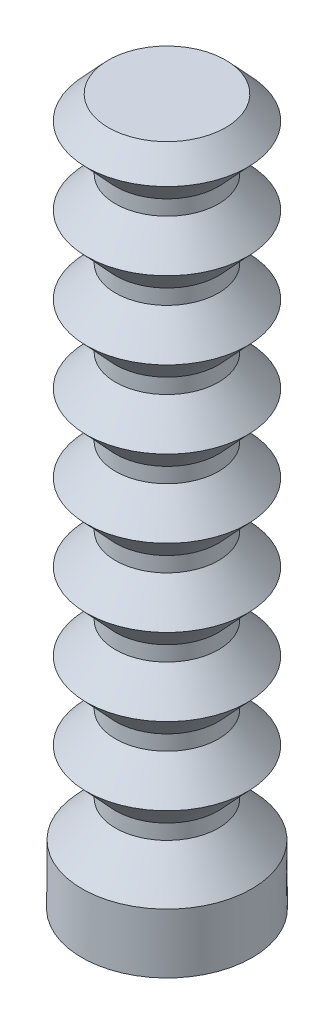
ISO-10303-21;
HEADER;
FILE_DESCRIPTION(('STEP AP214'),'2;1');
FILE_NAME('part.step','',(''),(''),'','','');
FILE_SCHEMA(('AUTOMOTIVE_DESIGN { 1 0 10303 214 1 1 1 1 }'));
ENDSEC;
DATA;
#1=APPLICATION_CONTEXT('core data for automotive mechanical design processes');
#2=APPLICATION_PROTOCOL_DEFINITION('international standard','automotive_design',2000,#1);
#3=PRODUCT_CONTEXT('',#1,'mechanical');
#4=PRODUCT('Part','Part','',(#3));
#5=PRODUCT_RELATED_PRODUCT_CATEGORY('part','',(#4));
#6=PRODUCT_DEFINITION_FORMATION('','',#4);
#7=PRODUCT_DEFINITION_CONTEXT('part definition',#1,'design');
#8=PRODUCT_DEFINITION('design','',#6,#7);
#9=PRODUCT_DEFINITION_SHAPE('','',#8);
#10=(LENGTH_UNIT() NAMED_UNIT(*) SI_UNIT(.MILLI.,.METRE.));
#11=(NAMED_UNIT(*) PLANE_ANGLE_UNIT() SI_UNIT($,.RADIAN.));
#12=(NAMED_UNIT(*) SI_UNIT($,.STERADIAN.) SOLID_ANGLE_UNIT());
#13=UNCERTAINTY_MEASURE_WITH_UNIT(LENGTH_MEASURE(1.E-05),#10,'distance_accuracy_value','');
#14=(GEOMETRIC_REPRESENTATION_CONTEXT(3) GLOBAL_UNCERTAINTY_ASSIGNED_CONTEXT((#13)) GLOBAL_UNIT_ASSIGNED_CONTEXT((#10,
#11,#12)) REPRESENTATION_CONTEXT('',''));
#15=CARTESIAN_POINT('',(0.,0.,0.));
#16=DIRECTION('',(0.,0.,1.));
#17=DIRECTION('',(1.,0.,0.));
#18=AXIS2_PLACEMENT_3D('',#15,#16,#17);
#19=CARTESIAN_POINT('',(-0.490246862964917,-0.95443319236906,0.));
#20=DIRECTION('',(0.,1.,0.));
#21=DIRECTION('',(-1.,0.,0.));
#22=AXIS2_PLACEMENT_3D('',#19,#20,#21);
#23=PLANE('',#22);
#24=CARTESIAN_POINT('',(-5.43163068128709,-0.954433192369061,0.));
#25=DIRECTION('',(0.,1.,0.));
#26=DIRECTION('',(-1.,0.,0.));
#27=AXIS2_PLACEMENT_3D('',#24,#25,#26);
#28=CIRCLE('',#27,4.13680574095251);
#29=CARTESIAN_POINT('',(-9.5684364222396,-0.954433192369061,0.));
#30=VERTEX_POINT('',#29);
#31=EDGE_CURVE('E38',#30,#30,#28,.F.);
#32=ORIENTED_EDGE('',*,*,#31,.T.);
#33=EDGE_LOOP('',(#32));
#34=FACE_BOUND('',#33,.T.);
#35=ADVANCED_FACE('F35',(#34),#23,.F.);
#36=CARTESIAN_POINT('',(-5.43163068128709,2.24093670680307,0.));
#37=DIRECTION('',(0.,-1.,0.));
#38=DIRECTION('',(1.,0.,0.));
#39=AXIS2_PLACEMENT_3D('',#36,#37,#38);
#40=CONICAL_SURFACE('',#39,4.11857195113181,0.00570625388925565);
#41=ORIENTED_EDGE('',*,*,#31,.F.);
#42=EDGE_LOOP('',(#41));
#43=FACE_BOUND('',#42,.T.);
#44=CARTESIAN_POINT('',(-5.43163068128709,1.92940061099429,0.));
#45=DIRECTION('',(0.,-1.,0.));
#46=DIRECTION('',(1.,0.,0.));
#47=AXIS2_PLACEMENT_3D('',#44,#45,#46);
#48=CIRCLE('',#47,4.12034967448522);
#49=CARTESIAN_POINT('',(-1.31128100680187,1.92940061099429,0.));
#50=VERTEX_POINT('',#49);
#51=EDGE_CURVE('E117',#50,#50,#48,.T.);
#52=ORIENTED_EDGE('',*,*,#51,.T.);
#53=EDGE_LOOP('',(#52));
#54=FACE_BOUND('',#53,.T.);
#55=ADVANCED_FACE('F125',(#43,#54),#40,.T.);
#56=CARTESIAN_POINT('',(-5.43163068128709,3.44402255402613,0.));
#57=DIRECTION('',(0.,-1.,0.));
#58=DIRECTION('',(1.,0.,0.));
#59=AXIS2_PLACEMENT_3D('',#56,#57,#58);
#60=CONICAL_SURFACE('',#59,2.7137894410461,0.74842256535505);
#61=ORIENTED_EDGE('',*,*,#51,.F.);
#62=EDGE_LOOP('',(#61));
#63=FACE_BOUND('',#62,.T.);
#64=CARTESIAN_POINT('',(-5.43163068128709,3.6742367822535,0.));
#65=DIRECTION('',(0.,-1.,0.));
#66=DIRECTION('',(1.,0.,0.));
#67=AXIS2_PLACEMENT_3D('',#64,#65,#66);
#68=CIRCLE('',#67,2.50000000000029);
#69=CARTESIAN_POINT('',(-2.9316306812868,3.6742367822535,0.));
#70=VERTEX_POINT('',#69);
#71=EDGE_CURVE('E115',#70,#70,#68,.T.);
#72=ORIENTED_EDGE('',*,*,#71,.T.);
#73=EDGE_LOOP('',(#72));
#74=FACE_BOUND('',#73,.T.);
#75=ADVANCED_FACE('F127',(#63,#74),#60,.T.);
#76=CARTESIAN_POINT('',(-5.43163068128709,34.1029540037317,0.));
#77=DIRECTION('',(0.,-1.,0.));
#78=DIRECTION('',(1.,0.,0.));
#79=AXIS2_PLACEMENT_3D('',#76,#77,#78);
#80=CYLINDRICAL_SURFACE('',#79,2.50000000000029);
#81=ORIENTED_EDGE('',*,*,#71,.F.);
#82=EDGE_LOOP('',(#81));
#83=FACE_BOUND('',#82,.T.);
#84=CARTESIAN_POINT('',(-5.43163068128709,4.40328862763758,0.));
#85=DIRECTION('',(0.,1.,0.));
#86=DIRECTION('',(-1.,0.,0.));
#87=AXIS2_PLACEMENT_3D('',#84,#85,#86);
#88=CIRCLE('',#87,2.50000000000029);
#89=CARTESIAN_POINT('',(-7.93163068128738,4.40328862763758,0.));
#90=VERTEX_POINT('',#89);
#91=EDGE_CURVE('E112',#90,#90,#88,.F.);
#92=ORIENTED_EDGE('',*,*,#91,.T.);
#93=EDGE_LOOP('',(#92));
#94=FACE_BOUND('',#93,.T.);
#95=ADVANCED_FACE('F132',(#83,#94),#80,.T.);
#96=CARTESIAN_POINT('',(-5.43163068128709,6.45869245496514,0.));
#97=DIRECTION('',(0.,1.,0.));
#98=DIRECTION('',(-1.,0.,0.));
#99=AXIS2_PLACEMENT_3D('',#96,#97,#98);
#100=CONICAL_SURFACE('',#99,4.41462274326432,0.749952023138733);
#101=ORIENTED_EDGE('',*,*,#91,.F.);
#102=EDGE_LOOP('',(#101));
#103=FACE_BOUND('',#102,.T.);
#104=CARTESIAN_POINT('',(-5.43163068128709,5.91340953088234,0.));
#105=DIRECTION('',(0.,-1.,0.));
#106=DIRECTION('',(1.,0.,0.));
#107=AXIS2_PLACEMENT_3D('',#104,#105,#106);
#108=CIRCLE('',#107,3.90668796466664);
#109=CARTESIAN_POINT('',(-1.52494271662045,5.91340953088234,0.));
#110=VERTEX_POINT('',#109);
#111=EDGE_CURVE('E109',#110,#110,#108,.T.);
#112=ORIENTED_EDGE('',*,*,#111,.T.);
#113=EDGE_LOOP('',(#112));
#114=FACE_BOUND('',#113,.T.);
#115=ADVANCED_FACE('F229',(#103,#114),#100,.T.);
#116=CARTESIAN_POINT('',(-5.43163068128709,7.19312660679953,0.));
#117=DIRECTION('',(0.,-1.,0.));
#118=DIRECTION('',(1.,0.,0.));
#119=AXIS2_PLACEMENT_3D('',#116,#117,#118);
#120=CONICAL_SURFACE('',#119,2.71462274326432,0.749952023138734);
#121=ORIENTED_EDGE('',*,*,#111,.F.);
#122=EDGE_LOOP('',(#121));
#123=FACE_BOUND('',#122,.T.);
#124=CARTESIAN_POINT('',(-5.43163068128709,7.42353043412714,0.));
#125=DIRECTION('',(0.,-1.,0.));
#126=DIRECTION('',(1.,0.,0.));
#127=AXIS2_PLACEMENT_3D('',#124,#125,#126);
#128=CIRCLE('',#127,2.50000000000025);
#129=CARTESIAN_POINT('',(-2.93163068128684,7.42353043412714,0.));
#130=VERTEX_POINT('',#129);
#131=EDGE_CURVE('E106',#130,#130,#128,.T.);
#132=ORIENTED_EDGE('',*,*,#131,.T.);
#133=EDGE_LOOP('',(#132));
#134=FACE_BOUND('',#133,.T.);
#135=ADVANCED_FACE('F225',(#123,#134),#120,.T.);
#136=CARTESIAN_POINT('',(-5.43163068128709,34.1029540037317,0.));
#137=DIRECTION('',(0.,-1.,0.));
#138=DIRECTION('',(1.,0.,0.));
#139=AXIS2_PLACEMENT_3D('',#136,#137,#138);
#140=CYLINDRICAL_SURFACE('',#139,2.50000000000025);
#141=ORIENTED_EDGE('',*,*,#131,.F.);
#142=EDGE_LOOP('',(#141));
#143=FACE_BOUND('',#142,.T.);
#144=CARTESIAN_POINT('',(-5.43163068128709,8.15328862763762,0.));
#145=DIRECTION('',(0.,1.,0.));
#146=DIRECTION('',(-1.,0.,0.));
#147=AXIS2_PLACEMENT_3D('',#144,#145,#146);
#148=CIRCLE('',#147,2.50000000000025);
#149=CARTESIAN_POINT('',(-7.93163068128734,8.15328862763762,0.));
#150=VERTEX_POINT('',#149);
#151=EDGE_CURVE('E103',#150,#150,#148,.F.);
#152=ORIENTED_EDGE('',*,*,#151,.T.);
#153=EDGE_LOOP('',(#152));
#154=FACE_BOUND('',#153,.T.);
#155=ADVANCED_FACE('F221',(#143,#154),#140,.T.);
#156=CARTESIAN_POINT('',(-5.43163068128709,10.2086924549652,0.));
#157=DIRECTION('',(0.,1.,0.));
#158=DIRECTION('',(-1.,0.,0.));
#159=AXIS2_PLACEMENT_3D('',#156,#157,#158);
#160=CONICAL_SURFACE('',#159,4.41462274326428,0.749952023138734);
#161=ORIENTED_EDGE('',*,*,#151,.F.);
#162=EDGE_LOOP('',(#161));
#163=FACE_BOUND('',#162,.T.);
#164=CARTESIAN_POINT('',(-5.43163068128709,9.66340953088238,0.));
#165=DIRECTION('',(0.,-1.,0.));
#166=DIRECTION('',(1.,0.,0.));
#167=AXIS2_PLACEMENT_3D('',#164,#165,#166);
#168=CIRCLE('',#167,3.9066879646666);
#169=CARTESIAN_POINT('',(-1.52494271662049,9.66340953088238,0.));
#170=VERTEX_POINT('',#169);
#171=EDGE_CURVE('E100',#170,#170,#168,.T.);
#172=ORIENTED_EDGE('',*,*,#171,.T.);
#173=EDGE_LOOP('',(#172));
#174=FACE_BOUND('',#173,.T.);
#175=ADVANCED_FACE('F217',(#163,#174),#160,.T.);
#176=CARTESIAN_POINT('',(-5.43163068128709,10.9431266067996,0.));
#177=DIRECTION('',(0.,-1.,0.));
#178=DIRECTION('',(1.,0.,0.));
#179=AXIS2_PLACEMENT_3D('',#176,#177,#178);
#180=CONICAL_SURFACE('',#179,2.71462274326428,0.749952023138734);
#181=ORIENTED_EDGE('',*,*,#171,.F.);
#182=EDGE_LOOP('',(#181));
#183=FACE_BOUND('',#182,.T.);
#184=CARTESIAN_POINT('',(-5.43163068128709,11.1735304341272,0.));
#185=DIRECTION('',(0.,-1.,0.));
#186=DIRECTION('',(1.,0.,0.));
#187=AXIS2_PLACEMENT_3D('',#184,#185,#186);
#188=CIRCLE('',#187,2.50000000000021);
#189=CARTESIAN_POINT('',(-2.93163068128688,11.1735304341272,0.));
#190=VERTEX_POINT('',#189);
#191=EDGE_CURVE('E97',#190,#190,#188,.T.);
#192=ORIENTED_EDGE('',*,*,#191,.T.);
#193=EDGE_LOOP('',(#192));
#194=FACE_BOUND('',#193,.T.);
#195=ADVANCED_FACE('F213',(#183,#194),#180,.T.);
#196=CARTESIAN_POINT('',(-5.43163068128709,34.1029540037317,0.));
#197=DIRECTION('',(0.,-1.,0.));
#198=DIRECTION('',(1.,0.,0.));
#199=AXIS2_PLACEMENT_3D('',#196,#197,#198);
#200=CYLINDRICAL_SURFACE('',#199,2.50000000000021);
#201=ORIENTED_EDGE('',*,*,#191,.F.);
#202=EDGE_LOOP('',(#201));
#203=FACE_BOUND('',#202,.T.);
#204=CARTESIAN_POINT('',(-5.43163068128709,11.9032886276377,0.));
#205=DIRECTION('',(0.,1.,0.));
#206=DIRECTION('',(-1.,0.,0.));
#207=AXIS2_PLACEMENT_3D('',#204,#205,#206);
#208=CIRCLE('',#207,2.50000000000021);
#209=CARTESIAN_POINT('',(-7.93163068128731,11.9032886276377,0.));
#210=VERTEX_POINT('',#209);
#211=EDGE_CURVE('E94',#210,#210,#208,.F.);
#212=ORIENTED_EDGE('',*,*,#211,.T.);
#213=EDGE_LOOP('',(#212));
#214=FACE_BOUND('',#213,.T.);
#215=ADVANCED_FACE('F209',(#203,#214),#200,.T.);
#216=CARTESIAN_POINT('',(-5.43163068128709,13.9586924549652,0.));
#217=DIRECTION('',(0.,1.,0.));
#218=DIRECTION('',(-1.,0.,0.));
#219=AXIS2_PLACEMENT_3D('',#216,#217,#218);
#220=CONICAL_SURFACE('',#219,4.41462274326424,0.749952023138734);
#221=ORIENTED_EDGE('',*,*,#211,.F.);
#222=EDGE_LOOP('',(#221));
#223=FACE_BOUND('',#222,.T.);
#224=CARTESIAN_POINT('',(-5.43163068128709,13.4134095308824,0.));
#225=DIRECTION('',(0.,-1.,0.));
#226=DIRECTION('',(1.,0.,0.));
#227=AXIS2_PLACEMENT_3D('',#224,#225,#226);
#228=CIRCLE('',#227,3.90668796466656);
#229=CARTESIAN_POINT('',(-1.52494271662053,13.4134095308824,0.));
#230=VERTEX_POINT('',#229);
#231=EDGE_CURVE('E91',#230,#230,#228,.T.);
#232=ORIENTED_EDGE('',*,*,#231,.T.);
#233=EDGE_LOOP('',(#232));
#234=FACE_BOUND('',#233,.T.);
#235=ADVANCED_FACE('F205',(#223,#234),#220,.T.);
#236=CARTESIAN_POINT('',(-5.43163068128709,14.6931266067996,0.));
#237=DIRECTION('',(0.,-1.,0.));
#238=DIRECTION('',(1.,0.,0.));
#239=AXIS2_PLACEMENT_3D('',#236,#237,#238);
#240=CONICAL_SURFACE('',#239,2.71462274326424,0.749952023138734);
#241=ORIENTED_EDGE('',*,*,#231,.F.);
#242=EDGE_LOOP('',(#241));
#243=FACE_BOUND('',#242,.T.);
#244=CARTESIAN_POINT('',(-5.43163068128709,14.9235304341272,0.));
#245=DIRECTION('',(0.,-1.,0.));
#246=DIRECTION('',(1.,0.,0.));
#247=AXIS2_PLACEMENT_3D('',#244,#245,#246);
#248=CIRCLE('',#247,2.50000000000018);
#249=CARTESIAN_POINT('',(-2.93163068128692,14.9235304341272,0.));
#250=VERTEX_POINT('',#249);
#251=EDGE_CURVE('E88',#250,#250,#248,.T.);
#252=ORIENTED_EDGE('',*,*,#251,.T.);
#253=EDGE_LOOP('',(#252));
#254=FACE_BOUND('',#253,.T.);
#255=ADVANCED_FACE('F201',(#243,#254),#240,.T.);
#256=CARTESIAN_POINT('',(-5.43163068128709,34.1029540037317,0.));
#257=DIRECTION('',(0.,-1.,0.));
#258=DIRECTION('',(1.,0.,0.));
#259=AXIS2_PLACEMENT_3D('',#256,#257,#258);
#260=CYLINDRICAL_SURFACE('',#259,2.50000000000018);
#261=ORIENTED_EDGE('',*,*,#251,.F.);
#262=EDGE_LOOP('',(#261));
#263=FACE_BOUND('',#262,.T.);
#264=CARTESIAN_POINT('',(-5.43163068128709,15.6532886276377,0.));
#265=DIRECTION('',(0.,1.,0.));
#266=DIRECTION('',(-1.,0.,0.));
#267=AXIS2_PLACEMENT_3D('',#264,#265,#266);
#268=CIRCLE('',#267,2.50000000000018);
#269=CARTESIAN_POINT('',(-7.93163068128727,15.6532886276377,0.));
#270=VERTEX_POINT('',#269);
#271=EDGE_CURVE('E85',#270,#270,#268,.F.);
#272=ORIENTED_EDGE('',*,*,#271,.T.);
#273=EDGE_LOOP('',(#272));
#274=FACE_BOUND('',#273,.T.);
#275=ADVANCED_FACE('F197',(#263,#274),#260,.T.);
#276=CARTESIAN_POINT('',(-5.43163068128709,17.7086924549653,0.));
#277=DIRECTION('',(0.,1.,0.));
#278=DIRECTION('',(-1.,0.,0.));
#279=AXIS2_PLACEMENT_3D('',#276,#277,#278);
#280=CONICAL_SURFACE('',#279,4.4146227432642,0.749952023138733);
#281=ORIENTED_EDGE('',*,*,#271,.F.);
#282=EDGE_LOOP('',(#281));
#283=FACE_BOUND('',#282,.T.);
#284=CARTESIAN_POINT('',(-5.43163068128709,17.1634095308825,0.));
#285=DIRECTION('',(0.,-1.,0.));
#286=DIRECTION('',(1.,0.,0.));
#287=AXIS2_PLACEMENT_3D('',#284,#285,#286);
#288=CIRCLE('',#287,3.90668796466652);
#289=CARTESIAN_POINT('',(-1.52494271662057,17.1634095308825,0.));
#290=VERTEX_POINT('',#289);
#291=EDGE_CURVE('E82',#290,#290,#288,.T.);
#292=ORIENTED_EDGE('',*,*,#291,.T.);
#293=EDGE_LOOP('',(#292));
#294=FACE_BOUND('',#293,.T.);
#295=ADVANCED_FACE('F193',(#283,#294),#280,.T.);
#296=CARTESIAN_POINT('',(-5.43163068128709,18.4431266067997,0.));
#297=DIRECTION('',(0.,-1.,0.));
#298=DIRECTION('',(1.,0.,0.));
#299=AXIS2_PLACEMENT_3D('',#296,#297,#298);
#300=CONICAL_SURFACE('',#299,2.7146227432642,0.749952023138734);
#301=ORIENTED_EDGE('',*,*,#291,.F.);
#302=EDGE_LOOP('',(#301));
#303=FACE_BOUND('',#302,.T.);
#304=CARTESIAN_POINT('',(-5.43163068128709,18.6735304341273,0.));
#305=DIRECTION('',(0.,-1.,0.));
#306=DIRECTION('',(1.,0.,0.));
#307=AXIS2_PLACEMENT_3D('',#304,#305,#306);
#308=CIRCLE('',#307,2.50000000000014);
#309=CARTESIAN_POINT('',(-2.93163068128696,18.6735304341273,0.));
#310=VERTEX_POINT('',#309);
#311=EDGE_CURVE('E79',#310,#310,#308,.T.);
#312=ORIENTED_EDGE('',*,*,#311,.T.);
#313=EDGE_LOOP('',(#312));
#314=FACE_BOUND('',#313,.T.);
#315=ADVANCED_FACE('F189',(#303,#314),#300,.T.);
#316=CARTESIAN_POINT('',(-5.43163068128709,34.1029540037317,0.));
#317=DIRECTION('',(0.,-1.,0.));
#318=DIRECTION('',(1.,0.,0.));
#319=AXIS2_PLACEMENT_3D('',#316,#317,#318);
#320=CYLINDRICAL_SURFACE('',#319,2.50000000000014);
#321=ORIENTED_EDGE('',*,*,#311,.F.);
#322=EDGE_LOOP('',(#321));
#323=FACE_BOUND('',#322,.T.);
#324=CARTESIAN_POINT('',(-5.43163068128709,19.4032886276377,0.));
#325=DIRECTION('',(0.,1.,0.));
#326=DIRECTION('',(-1.,0.,0.));
#327=AXIS2_PLACEMENT_3D('',#324,#325,#326);
#328=CIRCLE('',#327,2.50000000000014);
#329=CARTESIAN_POINT('',(-7.93163068128723,19.4032886276377,0.));
#330=VERTEX_POINT('',#329);
#331=EDGE_CURVE('E76',#330,#330,#328,.F.);
#332=ORIENTED_EDGE('',*,*,#331,.T.);
#333=EDGE_LOOP('',(#332));
#334=FACE_BOUND('',#333,.T.);
#335=ADVANCED_FACE('F185',(#323,#334),#320,.T.);
#336=CARTESIAN_POINT('',(-5.43163068128709,21.4586924549653,0.));
#337=DIRECTION('',(0.,1.,0.));
#338=DIRECTION('',(-1.,0.,0.));
#339=AXIS2_PLACEMENT_3D('',#336,#337,#338);
#340=CONICAL_SURFACE('',#339,4.41462274326417,0.749952023138733);
#341=ORIENTED_EDGE('',*,*,#331,.F.);
#342=EDGE_LOOP('',(#341));
#343=FACE_BOUND('',#342,.T.);
#344=CARTESIAN_POINT('',(-5.43163068128709,20.9134095308825,0.));
#345=DIRECTION('',(0.,-1.,0.));
#346=DIRECTION('',(1.,0.,0.));
#347=AXIS2_PLACEMENT_3D('',#344,#345,#346);
#348=CIRCLE('',#347,3.90668796466648);
#349=CARTESIAN_POINT('',(-1.52494271662061,20.9134095308825,0.));
#350=VERTEX_POINT('',#349);
#351=EDGE_CURVE('E73',#350,#350,#348,.T.);
#352=ORIENTED_EDGE('',*,*,#351,.T.);
#353=EDGE_LOOP('',(#352));
#354=FACE_BOUND('',#353,.T.);
#355=ADVANCED_FACE('F181',(#343,#354),#340,.T.);
#356=CARTESIAN_POINT('',(-5.43163068128709,22.1931266067997,0.));
#357=DIRECTION('',(0.,-1.,0.));
#358=DIRECTION('',(1.,0.,0.));
#359=AXIS2_PLACEMENT_3D('',#356,#357,#358);
#360=CONICAL_SURFACE('',#359,2.71462274326417,0.749952023138733);
#361=ORIENTED_EDGE('',*,*,#351,.F.);
#362=EDGE_LOOP('',(#361));
#363=FACE_BOUND('',#362,.T.);
#364=CARTESIAN_POINT('',(-5.43163068128709,22.4235304341273,0.));
#365=DIRECTION('',(0.,-1.,0.));
#366=DIRECTION('',(1.,0.,0.));
#367=AXIS2_PLACEMENT_3D('',#364,#365,#366);
#368=CIRCLE('',#367,2.5000000000001);
#369=CARTESIAN_POINT('',(-2.931630681287,22.4235304341273,0.));
#370=VERTEX_POINT('',#369);
#371=EDGE_CURVE('E70',#370,#370,#368,.T.);
#372=ORIENTED_EDGE('',*,*,#371,.T.);
#373=EDGE_LOOP('',(#372));
#374=FACE_BOUND('',#373,.T.);
#375=ADVANCED_FACE('F177',(#363,#374),#360,.T.);
#376=CARTESIAN_POINT('',(-5.43163068128709,34.1029540037317,0.));
#377=DIRECTION('',(0.,-1.,0.));
#378=DIRECTION('',(1.,0.,0.));
#379=AXIS2_PLACEMENT_3D('',#376,#377,#378);
#380=CYLINDRICAL_SURFACE('',#379,2.5000000000001);
#381=ORIENTED_EDGE('',*,*,#371,.F.);
#382=EDGE_LOOP('',(#381));
#383=FACE_BOUND('',#382,.T.);
#384=CARTESIAN_POINT('',(-5.43163068128709,23.1532886276378,0.));
#385=DIRECTION('',(0.,1.,0.));
#386=DIRECTION('',(-1.,0.,0.));
#387=AXIS2_PLACEMENT_3D('',#384,#385,#386);
#388=CIRCLE('',#387,2.5000000000001);
#389=CARTESIAN_POINT('',(-7.93163068128719,23.1532886276378,0.));
#390=VERTEX_POINT('',#389);
#391=EDGE_CURVE('E67',#390,#390,#388,.F.);
#392=ORIENTED_EDGE('',*,*,#391,.T.);
#393=EDGE_LOOP('',(#392));
#394=FACE_BOUND('',#393,.T.);
#395=ADVANCED_FACE('F173',(#383,#394),#380,.T.);
#396=CARTESIAN_POINT('',(-5.43163068128709,25.2086924549653,0.));
#397=DIRECTION('',(0.,1.,0.));
#398=DIRECTION('',(-1.,0.,0.));
#399=AXIS2_PLACEMENT_3D('',#396,#397,#398);
#400=CONICAL_SURFACE('',#399,4.41462274326413,0.749952023138734);
#401=ORIENTED_EDGE('',*,*,#391,.F.);
#402=EDGE_LOOP('',(#401));
#403=FACE_BOUND('',#402,.T.);
#404=CARTESIAN_POINT('',(-5.43163068128709,24.6634095308825,0.));
#405=DIRECTION('',(0.,-1.,0.));
#406=DIRECTION('',(1.,0.,0.));
#407=AXIS2_PLACEMENT_3D('',#404,#405,#406);
#408=CIRCLE('',#407,3.90668796466645);
#409=CARTESIAN_POINT('',(-1.52494271662064,24.6634095308825,0.));
#410=VERTEX_POINT('',#409);
#411=EDGE_CURVE('E64',#410,#410,#408,.T.);
#412=ORIENTED_EDGE('',*,*,#411,.T.);
#413=EDGE_LOOP('',(#412));
#414=FACE_BOUND('',#413,.T.);
#415=ADVANCED_FACE('F169',(#403,#414),#400,.T.);
#416=CARTESIAN_POINT('',(-5.43163068128709,25.9431266067997,0.));
#417=DIRECTION('',(0.,-1.,0.));
#418=DIRECTION('',(1.,0.,0.));
#419=AXIS2_PLACEMENT_3D('',#416,#417,#418);
#420=CONICAL_SURFACE('',#419,2.71462274326413,0.749952023138734);
#421=ORIENTED_EDGE('',*,*,#411,.F.);
#422=EDGE_LOOP('',(#421));
#423=FACE_BOUND('',#422,.T.);
#424=CARTESIAN_POINT('',(-5.43163068128709,26.1735304341273,0.));
#425=DIRECTION('',(0.,-1.,0.));
#426=DIRECTION('',(1.,0.,0.));
#427=AXIS2_PLACEMENT_3D('',#424,#425,#426);
#428=CIRCLE('',#427,2.50000000000006);
#429=CARTESIAN_POINT('',(-2.93163068128704,26.1735304341273,0.));
#430=VERTEX_POINT('',#429);
#431=EDGE_CURVE('E61',#430,#430,#428,.T.);
#432=ORIENTED_EDGE('',*,*,#431,.T.);
#433=EDGE_LOOP('',(#432));
#434=FACE_BOUND('',#433,.T.);
#435=ADVANCED_FACE('F165',(#423,#434),#420,.T.);
#436=CARTESIAN_POINT('',(-5.43163068128709,34.1029540037317,0.));
#437=DIRECTION('',(0.,-1.,0.));
#438=DIRECTION('',(1.,0.,0.));
#439=AXIS2_PLACEMENT_3D('',#436,#437,#438);
#440=CYLINDRICAL_SURFACE('',#439,2.50000000000006);
#441=ORIENTED_EDGE('',*,*,#431,.F.);
#442=EDGE_LOOP('',(#441));
#443=FACE_BOUND('',#442,.T.);
#444=CARTESIAN_POINT('',(-5.43163068128709,26.9032886276378,0.));
#445=DIRECTION('',(0.,1.,0.));
#446=DIRECTION('',(-1.,0.,0.));
#447=AXIS2_PLACEMENT_3D('',#444,#445,#446);
#448=CIRCLE('',#447,2.50000000000006);
#449=CARTESIAN_POINT('',(-7.93163068128715,26.9032886276378,0.));
#450=VERTEX_POINT('',#449);
#451=EDGE_CURVE('E58',#450,#450,#448,.F.);
#452=ORIENTED_EDGE('',*,*,#451,.T.);
#453=EDGE_LOOP('',(#452));
#454=FACE_BOUND('',#453,.T.);
#455=ADVANCED_FACE('F161',(#443,#454),#440,.T.);
#456=CARTESIAN_POINT('',(-5.43163068128709,28.9586924549654,0.));
#457=DIRECTION('',(0.,1.,0.));
#458=DIRECTION('',(-1.,0.,0.));
#459=AXIS2_PLACEMENT_3D('',#456,#457,#458);
#460=CONICAL_SURFACE('',#459,4.41462274326409,0.749952023138734);
#461=ORIENTED_EDGE('',*,*,#451,.F.);
#462=EDGE_LOOP('',(#461));
#463=FACE_BOUND('',#462,.T.);
#464=CARTESIAN_POINT('',(-5.43163068128709,28.4134095308826,0.));
#465=DIRECTION('',(0.,-1.,0.));
#466=DIRECTION('',(1.,0.,0.));
#467=AXIS2_PLACEMENT_3D('',#464,#465,#466);
#468=CIRCLE('',#467,3.90668796466641);
#469=CARTESIAN_POINT('',(-1.52494271662068,28.4134095308826,0.));
#470=VERTEX_POINT('',#469);
#471=EDGE_CURVE('E55',#470,#470,#468,.T.);
#472=ORIENTED_EDGE('',*,*,#471,.T.);
#473=EDGE_LOOP('',(#472));
#474=FACE_BOUND('',#473,.T.);
#475=ADVANCED_FACE('F157',(#463,#474),#460,.T.);
#476=CARTESIAN_POINT('',(-5.43163068128709,29.6931266067998,0.));
#477=DIRECTION('',(0.,-1.,0.));
#478=DIRECTION('',(1.,0.,0.));
#479=AXIS2_PLACEMENT_3D('',#476,#477,#478);
#480=CONICAL_SURFACE('',#479,2.71462274326405,0.749952023138734);
#481=ORIENTED_EDGE('',*,*,#471,.F.);
#482=EDGE_LOOP('',(#481));
#483=FACE_BOUND('',#482,.T.);
#484=CARTESIAN_POINT('',(-5.43163068128709,29.9235304341274,0.));
#485=DIRECTION('',(0.,-1.,0.));
#486=DIRECTION('',(1.,0.,0.));
#487=AXIS2_PLACEMENT_3D('',#484,#485,#486);
#488=CIRCLE('',#487,2.5);
#489=CARTESIAN_POINT('',(-2.93163068128709,29.9235304341274,0.));
#490=VERTEX_POINT('',#489);
#491=EDGE_CURVE('E52',#490,#490,#488,.T.);
#492=ORIENTED_EDGE('',*,*,#491,.T.);
#493=EDGE_LOOP('',(#492));
#494=FACE_BOUND('',#493,.T.);
#495=ADVANCED_FACE('F153',(#483,#494),#480,.T.);
#496=CARTESIAN_POINT('',(-5.43163068128709,34.1029540037317,0.));
#497=DIRECTION('',(0.,-1.,0.));
#498=DIRECTION('',(1.,0.,0.));
#499=AXIS2_PLACEMENT_3D('',#496,#497,#498);
#500=CYLINDRICAL_SURFACE('',#499,2.5);
#501=ORIENTED_EDGE('',*,*,#491,.F.);
#502=EDGE_LOOP('',(#501));
#503=FACE_BOUND('',#502,.T.);
#504=CARTESIAN_POINT('',(-5.43163068128709,30.6532886276378,0.));
#505=DIRECTION('',(0.,1.,0.));
#506=DIRECTION('',(-1.,0.,0.));
#507=AXIS2_PLACEMENT_3D('',#504,#505,#506);
#508=CIRCLE('',#507,2.5);
#509=CARTESIAN_POINT('',(-7.93163068128709,30.6532886276378,0.));
#510=VERTEX_POINT('',#509);
#511=EDGE_CURVE('E47',#510,#510,#508,.F.);
#512=ORIENTED_EDGE('',*,*,#511,.T.);
#513=EDGE_LOOP('',(#512));
#514=FACE_BOUND('',#513,.T.);
#515=ADVANCED_FACE('F149',(#503,#514),#500,.T.);
#516=CARTESIAN_POINT('',(-5.43163068128709,32.7086924549654,0.));
#517=DIRECTION('',(0.,1.,0.));
#518=DIRECTION('',(-1.,0.,0.));
#519=AXIS2_PLACEMENT_3D('',#516,#517,#518);
#520=CONICAL_SURFACE('',#519,4.41462274326405,0.749952023138734);
#521=ORIENTED_EDGE('',*,*,#511,.F.);
#522=EDGE_LOOP('',(#521));
#523=FACE_BOUND('',#522,.T.);
#524=CARTESIAN_POINT('',(-5.43163068128709,32.1634095308826,0.));
#525=DIRECTION('',(0.,-1.,0.));
#526=DIRECTION('',(1.,0.,0.));
#527=AXIS2_PLACEMENT_3D('',#524,#525,#526);
#528=CIRCLE('',#527,3.90668796466637);
#529=CARTESIAN_POINT('',(-1.52494271662073,32.1634095308826,0.));
#530=VERTEX_POINT('',#529);
#531=EDGE_CURVE('E42',#530,#530,#528,.T.);
#532=ORIENTED_EDGE('',*,*,#531,.T.);
#533=EDGE_LOOP('',(#532));
#534=FACE_BOUND('',#533,.T.);
#535=ADVANCED_FACE('F143',(#523,#534),#520,.T.);
#536=CARTESIAN_POINT('',(-5.43163068128709,33.4431266067998,0.));
#537=DIRECTION('',(0.,-1.,0.));
#538=DIRECTION('',(1.,0.,0.));
#539=AXIS2_PLACEMENT_3D('',#536,#537,#538);
#540=CONICAL_SURFACE('',#539,2.71462274326405,0.749952023138734);
#541=ORIENTED_EDGE('',*,*,#531,.F.);
#542=EDGE_LOOP('',(#541));
#543=FACE_BOUND('',#542,.T.);
#544=CARTESIAN_POINT('',(-5.43163068128709,33.3029540037317,0.));
#545=DIRECTION('',(0.,-1.,0.));
#546=DIRECTION('',(1.,0.,0.));
#547=AXIS2_PLACEMENT_3D('',#544,#545,#546);
#548=CIRCLE('',#547,2.84519448310834);
#549=CARTESIAN_POINT('',(-2.58643619817875,33.3029540037317,0.));
#550=VERTEX_POINT('',#549);
#551=EDGE_CURVE('E10',#550,#550,#548,.T.);
#552=ORIENTED_EDGE('',*,*,#551,.T.);
#553=EDGE_LOOP('',(#552));
#554=FACE_BOUND('',#553,.T.);
#555=ADVANCED_FACE('F137',(#543,#554),#540,.T.);
#556=CARTESIAN_POINT('',(-5.43163068128709,33.3029540037317,0.));
#557=DIRECTION('',(0.,-1.,0.));
#558=DIRECTION('',(1.,0.,0.));
#559=AXIS2_PLACEMENT_3D('',#556,#557,#558);
#560=PLANE('',#559);
#561=ORIENTED_EDGE('',*,*,#551,.F.);
#562=EDGE_LOOP('',(#561));
#563=FACE_BOUND('',#562,.T.);
#564=ADVANCED_FACE('F135',(#563),#560,.F.);
#565=CLOSED_SHELL('',(#35,#55,#75,#95,#115,#135,#155,#175,#195,#215,#235,#255,#275,#295,#315,
#335,#355,#375,#395,#415,#435,#455,#475,#495,#515,#535,#555,#564));
#566=MANIFOLD_SOLID_BREP('B2',#565);
#567=ADVANCED_BREP_SHAPE_REPRESENTATION('',(#18,#566),#14);
#568=SHAPE_DEFINITION_REPRESENTATION(#9,#567);
ENDSEC;
END-ISO-10303-21;
